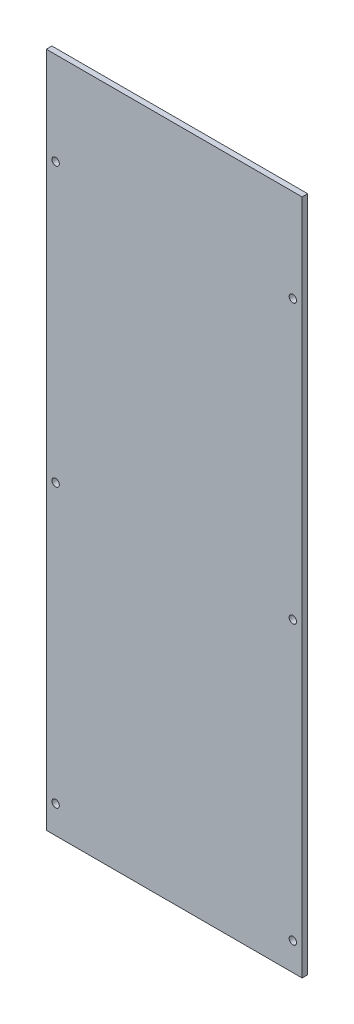
ISO-10303-21;
HEADER;
FILE_DESCRIPTION(('STEP AP214'),'2;1');
FILE_NAME('part.step','',(''),(''),'','','');
FILE_SCHEMA(('AUTOMOTIVE_DESIGN { 1 0 10303 214 1 1 1 1 }'));
ENDSEC;
DATA;
#1=APPLICATION_CONTEXT('core data for automotive mechanical design processes');
#2=APPLICATION_PROTOCOL_DEFINITION('international standard','automotive_design',2000,#1);
#3=PRODUCT_CONTEXT('',#1,'mechanical');
#4=PRODUCT('Part','Part','',(#3));
#5=PRODUCT_RELATED_PRODUCT_CATEGORY('part','',(#4));
#6=PRODUCT_DEFINITION_FORMATION('','',#4);
#7=PRODUCT_DEFINITION_CONTEXT('part definition',#1,'design');
#8=PRODUCT_DEFINITION('design','',#6,#7);
#9=PRODUCT_DEFINITION_SHAPE('','',#8);
#10=(LENGTH_UNIT() NAMED_UNIT(*) SI_UNIT(.MILLI.,.METRE.));
#11=(NAMED_UNIT(*) PLANE_ANGLE_UNIT() SI_UNIT($,.RADIAN.));
#12=(NAMED_UNIT(*) SI_UNIT($,.STERADIAN.) SOLID_ANGLE_UNIT());
#13=UNCERTAINTY_MEASURE_WITH_UNIT(LENGTH_MEASURE(1.E-05),#10,'distance_accuracy_value','');
#14=(GEOMETRIC_REPRESENTATION_CONTEXT(3) GLOBAL_UNCERTAINTY_ASSIGNED_CONTEXT((#13)) GLOBAL_UNIT_ASSIGNED_CONTEXT((#10,
#11,#12)) REPRESENTATION_CONTEXT('',''));
#15=CARTESIAN_POINT('',(0.,0.,0.));
#16=DIRECTION('',(0.,0.,1.));
#17=DIRECTION('',(1.,0.,0.));
#18=AXIS2_PLACEMENT_3D('',#15,#16,#17);
#19=CARTESIAN_POINT('',(0.,0.,3.));
#20=DIRECTION('',(0.,0.,1.));
#21=DIRECTION('',(1.,0.,0.));
#22=AXIS2_PLACEMENT_3D('',#19,#20,#21);
#23=PLANE('',#22);
#24=CARTESIAN_POINT('',(133.,-50.,3.));
#25=DIRECTION('',(0.,0.,1.));
#26=DIRECTION('',(1.,0.,0.));
#27=AXIS2_PLACEMENT_3D('',#24,#25,#26);
#28=CIRCLE('',#27,2.);
#29=CARTESIAN_POINT('',(135.,-50.,3.));
#30=VERTEX_POINT('',#29);
#31=EDGE_CURVE('E132',#30,#30,#28,.T.);
#32=ORIENTED_EDGE('',*,*,#31,.F.);
#33=EDGE_LOOP('',(#32));
#34=FACE_BOUND('',#33,.T.);
#35=CARTESIAN_POINT('',(133.000000000001,-200.,3.));
#36=DIRECTION('',(0.,0.,1.));
#37=DIRECTION('',(1.,0.,0.));
#38=AXIS2_PLACEMENT_3D('',#35,#36,#37);
#39=CIRCLE('',#38,2.);
#40=CARTESIAN_POINT('',(135.000000000001,-200.,3.));
#41=VERTEX_POINT('',#40);
#42=EDGE_CURVE('E120',#41,#41,#39,.T.);
#43=ORIENTED_EDGE('',*,*,#42,.F.);
#44=EDGE_LOOP('',(#43));
#45=FACE_BOUND('',#44,.T.);
#46=CARTESIAN_POINT('',(133.000000000002,-350.,3.));
#47=DIRECTION('',(0.,0.,1.));
#48=DIRECTION('',(1.,0.,0.));
#49=AXIS2_PLACEMENT_3D('',#46,#47,#48);
#50=CIRCLE('',#49,2.);
#51=CARTESIAN_POINT('',(135.000000000002,-350.,3.));
#52=VERTEX_POINT('',#51);
#53=EDGE_CURVE('E99',#52,#52,#50,.T.);
#54=ORIENTED_EDGE('',*,*,#53,.F.);
#55=EDGE_LOOP('',(#54));
#56=FACE_BOUND('',#55,.T.);
#57=DIRECTION('',(0.,-1.,0.));
#58=VECTOR('',#57,1.);
#59=CARTESIAN_POINT('',(0.,0.,3.));
#60=LINE('',#59,#58);
#61=CARTESIAN_POINT('',(0.,0.,3.));
#62=VERTEX_POINT('',#61);
#63=CARTESIAN_POINT('',(0.,-365.000000000006,3.));
#64=VERTEX_POINT('',#63);
#65=EDGE_CURVE('E84',#62,#64,#60,.T.);
#66=ORIENTED_EDGE('',*,*,#65,.T.);
#67=DIRECTION('',(1.,0.,0.));
#68=VECTOR('',#67,1.);
#69=CARTESIAN_POINT('',(0.,-365.000000000006,3.));
#70=LINE('',#69,#68);
#71=CARTESIAN_POINT('',(138.,-365.000000000006,3.));
#72=VERTEX_POINT('',#71);
#73=EDGE_CURVE('E79',#64,#72,#70,.T.);
#74=ORIENTED_EDGE('',*,*,#73,.T.);
#75=DIRECTION('',(0.,1.,0.));
#76=VECTOR('',#75,1.);
#77=CARTESIAN_POINT('',(138.,0.,3.));
#78=LINE('',#77,#76);
#79=CARTESIAN_POINT('',(138.,0.,3.));
#80=VERTEX_POINT('',#79);
#81=EDGE_CURVE('E82',#72,#80,#78,.T.);
#82=ORIENTED_EDGE('',*,*,#81,.T.);
#83=DIRECTION('',(-1.,0.,0.));
#84=VECTOR('',#83,1.);
#85=CARTESIAN_POINT('',(0.,0.,3.));
#86=LINE('',#85,#84);
#87=EDGE_CURVE('E49',#80,#62,#86,.T.);
#88=ORIENTED_EDGE('',*,*,#87,.T.);
#89=EDGE_LOOP('',(#66,#74,#82,#88));
#90=FACE_BOUND('',#89,.T.);
#91=CARTESIAN_POINT('',(5.00000000000211,-350.000000000001,3.));
#92=DIRECTION('',(0.,0.,1.));
#93=DIRECTION('',(1.,0.,0.));
#94=AXIS2_PLACEMENT_3D('',#91,#92,#93);
#95=CIRCLE('',#94,2.);
#96=CARTESIAN_POINT('',(7.00000000000211,-350.000000000001,3.));
#97=VERTEX_POINT('',#96);
#98=EDGE_CURVE('E114',#97,#97,#95,.T.);
#99=ORIENTED_EDGE('',*,*,#98,.F.);
#100=EDGE_LOOP('',(#99));
#101=FACE_BOUND('',#100,.T.);
#102=CARTESIAN_POINT('',(5.00000000000106,-200.000000000001,3.));
#103=DIRECTION('',(0.,0.,1.));
#104=DIRECTION('',(1.,0.,0.));
#105=AXIS2_PLACEMENT_3D('',#102,#103,#104);
#106=CIRCLE('',#105,2.);
#107=CARTESIAN_POINT('',(7.00000000000106,-200.000000000001,3.));
#108=VERTEX_POINT('',#107);
#109=EDGE_CURVE('E126',#108,#108,#106,.T.);
#110=ORIENTED_EDGE('',*,*,#109,.F.);
#111=EDGE_LOOP('',(#110));
#112=FACE_BOUND('',#111,.T.);
#113=CARTESIAN_POINT('',(5.,-50.0000000000009,3.));
#114=DIRECTION('',(0.,0.,1.));
#115=DIRECTION('',(1.,0.,0.));
#116=AXIS2_PLACEMENT_3D('',#113,#114,#115);
#117=CIRCLE('',#116,2.);
#118=CARTESIAN_POINT('',(7.,-50.0000000000009,3.));
#119=VERTEX_POINT('',#118);
#120=EDGE_CURVE('E138',#119,#119,#117,.T.);
#121=ORIENTED_EDGE('',*,*,#120,.F.);
#122=EDGE_LOOP('',(#121));
#123=FACE_BOUND('',#122,.T.);
#124=ADVANCED_FACE('F32',(#34,#45,#56,#90,#101,#112,#123),#23,.T.);
#125=CARTESIAN_POINT('',(0.,0.,0.));
#126=DIRECTION('',(0.,0.,1.));
#127=DIRECTION('',(1.,0.,0.));
#128=AXIS2_PLACEMENT_3D('',#125,#126,#127);
#129=PLANE('',#128);
#130=DIRECTION('',(0.,-1.,0.));
#131=VECTOR('',#130,1.);
#132=CARTESIAN_POINT('',(0.,0.,0.));
#133=LINE('',#132,#131);
#134=CARTESIAN_POINT('',(0.,0.,0.));
#135=VERTEX_POINT('',#134);
#136=CARTESIAN_POINT('',(0.,-365.000000000006,0.));
#137=VERTEX_POINT('',#136);
#138=EDGE_CURVE('E96',#135,#137,#133,.T.);
#139=ORIENTED_EDGE('',*,*,#138,.F.);
#140=DIRECTION('',(-1.,0.,0.));
#141=VECTOR('',#140,1.);
#142=CARTESIAN_POINT('',(0.,0.,0.));
#143=LINE('',#142,#141);
#144=CARTESIAN_POINT('',(138.,0.,0.));
#145=VERTEX_POINT('',#144);
#146=EDGE_CURVE('E72',#145,#135,#143,.T.);
#147=ORIENTED_EDGE('',*,*,#146,.F.);
#148=DIRECTION('',(0.,1.,0.));
#149=VECTOR('',#148,1.);
#150=CARTESIAN_POINT('',(138.,0.,0.));
#151=LINE('',#150,#149);
#152=CARTESIAN_POINT('',(138.,-365.000000000006,0.));
#153=VERTEX_POINT('',#152);
#154=EDGE_CURVE('E66',#153,#145,#151,.T.);
#155=ORIENTED_EDGE('',*,*,#154,.F.);
#156=DIRECTION('',(1.,0.,0.));
#157=VECTOR('',#156,1.);
#158=CARTESIAN_POINT('',(0.,-365.000000000006,0.));
#159=LINE('',#158,#157);
#160=EDGE_CURVE('E88',#137,#153,#159,.T.);
#161=ORIENTED_EDGE('',*,*,#160,.F.);
#162=EDGE_LOOP('',(#139,#147,#155,#161));
#163=FACE_BOUND('',#162,.T.);
#164=CARTESIAN_POINT('',(133.000000000002,-350.,0.));
#165=DIRECTION('',(0.,0.,1.));
#166=DIRECTION('',(1.,0.,0.));
#167=AXIS2_PLACEMENT_3D('',#164,#165,#166);
#168=CIRCLE('',#167,2.);
#169=CARTESIAN_POINT('',(135.000000000002,-350.,0.));
#170=VERTEX_POINT('',#169);
#171=EDGE_CURVE('E111',#170,#170,#168,.T.);
#172=ORIENTED_EDGE('',*,*,#171,.T.);
#173=EDGE_LOOP('',(#172));
#174=FACE_BOUND('',#173,.T.);
#175=CARTESIAN_POINT('',(5.00000000000211,-350.000000000001,0.));
#176=DIRECTION('',(0.,0.,1.));
#177=DIRECTION('',(1.,0.,0.));
#178=AXIS2_PLACEMENT_3D('',#175,#176,#177);
#179=CIRCLE('',#178,2.);
#180=CARTESIAN_POINT('',(7.00000000000211,-350.000000000001,0.));
#181=VERTEX_POINT('',#180);
#182=EDGE_CURVE('E117',#181,#181,#179,.T.);
#183=ORIENTED_EDGE('',*,*,#182,.T.);
#184=EDGE_LOOP('',(#183));
#185=FACE_BOUND('',#184,.T.);
#186=CARTESIAN_POINT('',(133.000000000001,-200.,0.));
#187=DIRECTION('',(0.,0.,1.));
#188=DIRECTION('',(1.,0.,0.));
#189=AXIS2_PLACEMENT_3D('',#186,#187,#188);
#190=CIRCLE('',#189,2.);
#191=CARTESIAN_POINT('',(135.000000000001,-200.,0.));
#192=VERTEX_POINT('',#191);
#193=EDGE_CURVE('E123',#192,#192,#190,.T.);
#194=ORIENTED_EDGE('',*,*,#193,.T.);
#195=EDGE_LOOP('',(#194));
#196=FACE_BOUND('',#195,.T.);
#197=CARTESIAN_POINT('',(5.00000000000106,-200.000000000001,0.));
#198=DIRECTION('',(0.,0.,1.));
#199=DIRECTION('',(1.,0.,0.));
#200=AXIS2_PLACEMENT_3D('',#197,#198,#199);
#201=CIRCLE('',#200,2.);
#202=CARTESIAN_POINT('',(7.00000000000106,-200.000000000001,0.));
#203=VERTEX_POINT('',#202);
#204=EDGE_CURVE('E129',#203,#203,#201,.T.);
#205=ORIENTED_EDGE('',*,*,#204,.T.);
#206=EDGE_LOOP('',(#205));
#207=FACE_BOUND('',#206,.T.);
#208=CARTESIAN_POINT('',(133.,-50.,0.));
#209=DIRECTION('',(0.,0.,1.));
#210=DIRECTION('',(1.,0.,0.));
#211=AXIS2_PLACEMENT_3D('',#208,#209,#210);
#212=CIRCLE('',#211,2.);
#213=CARTESIAN_POINT('',(135.,-50.,0.));
#214=VERTEX_POINT('',#213);
#215=EDGE_CURVE('E135',#214,#214,#212,.T.);
#216=ORIENTED_EDGE('',*,*,#215,.T.);
#217=EDGE_LOOP('',(#216));
#218=FACE_BOUND('',#217,.T.);
#219=CARTESIAN_POINT('',(5.,-50.0000000000009,0.));
#220=DIRECTION('',(0.,0.,1.));
#221=DIRECTION('',(1.,0.,0.));
#222=AXIS2_PLACEMENT_3D('',#219,#220,#221);
#223=CIRCLE('',#222,2.);
#224=CARTESIAN_POINT('',(7.,-50.0000000000009,0.));
#225=VERTEX_POINT('',#224);
#226=EDGE_CURVE('E141',#225,#225,#223,.T.);
#227=ORIENTED_EDGE('',*,*,#226,.T.);
#228=EDGE_LOOP('',(#227));
#229=FACE_BOUND('',#228,.T.);
#230=ADVANCED_FACE('F107',(#163,#174,#185,#196,#207,#218,#229),#129,.F.);
#231=CARTESIAN_POINT('',(0.,0.,3.));
#232=DIRECTION('',(1.,0.,0.));
#233=DIRECTION('',(0.,0.,-1.));
#234=AXIS2_PLACEMENT_3D('',#231,#232,#233);
#235=PLANE('',#234);
#236=ORIENTED_EDGE('',*,*,#138,.T.);
#237=DIRECTION('',(0.,0.,-1.));
#238=VECTOR('',#237,1.);
#239=CARTESIAN_POINT('',(0.,-365.000000000006,3.));
#240=LINE('',#239,#238);
#241=EDGE_CURVE('E11',#64,#137,#240,.T.);
#242=ORIENTED_EDGE('',*,*,#241,.F.);
#243=ORIENTED_EDGE('',*,*,#65,.F.);
#244=DIRECTION('',(0.,0.,-1.));
#245=VECTOR('',#244,1.);
#246=CARTESIAN_POINT('',(0.,0.,3.));
#247=LINE('',#246,#245);
#248=EDGE_CURVE('E92',#62,#135,#247,.T.);
#249=ORIENTED_EDGE('',*,*,#248,.T.);
#250=EDGE_LOOP('',(#236,#242,#243,#249));
#251=FACE_BOUND('',#250,.T.);
#252=ADVANCED_FACE('F34',(#251),#235,.F.);
#253=CARTESIAN_POINT('',(0.,-365.000000000006,3.));
#254=DIRECTION('',(0.,1.,0.));
#255=DIRECTION('',(0.,0.,1.));
#256=AXIS2_PLACEMENT_3D('',#253,#254,#255);
#257=PLANE('',#256);
#258=ORIENTED_EDGE('',*,*,#160,.T.);
#259=DIRECTION('',(0.,0.,-1.));
#260=VECTOR('',#259,1.);
#261=CARTESIAN_POINT('',(138.,-365.000000000006,3.));
#262=LINE('',#261,#260);
#263=EDGE_CURVE('E41',#72,#153,#262,.T.);
#264=ORIENTED_EDGE('',*,*,#263,.F.);
#265=ORIENTED_EDGE('',*,*,#73,.F.);
#266=ORIENTED_EDGE('',*,*,#241,.T.);
#267=EDGE_LOOP('',(#258,#264,#265,#266));
#268=FACE_BOUND('',#267,.T.);
#269=ADVANCED_FACE('F87',(#268),#257,.F.);
#270=CARTESIAN_POINT('',(138.,0.,3.));
#271=DIRECTION('',(-1.,0.,0.));
#272=DIRECTION('',(0.,0.,1.));
#273=AXIS2_PLACEMENT_3D('',#270,#271,#272);
#274=PLANE('',#273);
#275=ORIENTED_EDGE('',*,*,#154,.T.);
#276=DIRECTION('',(0.,0.,-1.));
#277=VECTOR('',#276,1.);
#278=CARTESIAN_POINT('',(138.,0.,3.));
#279=LINE('',#278,#277);
#280=EDGE_CURVE('E89',#80,#145,#279,.T.);
#281=ORIENTED_EDGE('',*,*,#280,.F.);
#282=ORIENTED_EDGE('',*,*,#81,.F.);
#283=ORIENTED_EDGE('',*,*,#263,.T.);
#284=EDGE_LOOP('',(#275,#281,#282,#283));
#285=FACE_BOUND('',#284,.T.);
#286=ADVANCED_FACE('F90',(#285),#274,.F.);
#287=CARTESIAN_POINT('',(0.,0.,3.));
#288=DIRECTION('',(0.,-1.,0.));
#289=DIRECTION('',(0.,0.,-1.));
#290=AXIS2_PLACEMENT_3D('',#287,#288,#289);
#291=PLANE('',#290);
#292=ORIENTED_EDGE('',*,*,#146,.T.);
#293=ORIENTED_EDGE('',*,*,#248,.F.);
#294=ORIENTED_EDGE('',*,*,#87,.F.);
#295=ORIENTED_EDGE('',*,*,#280,.T.);
#296=EDGE_LOOP('',(#292,#293,#294,#295));
#297=FACE_BOUND('',#296,.T.);
#298=ADVANCED_FACE('F104',(#297),#291,.F.);
#299=CARTESIAN_POINT('',(133.000000000002,-350.,3.));
#300=DIRECTION('',(0.,0.,-1.));
#301=DIRECTION('',(-1.,0.,0.));
#302=AXIS2_PLACEMENT_3D('',#299,#300,#301);
#303=CYLINDRICAL_SURFACE('',#302,2.);
#304=ORIENTED_EDGE('',*,*,#53,.T.);
#305=EDGE_LOOP('',(#304));
#306=FACE_BOUND('',#305,.T.);
#307=ORIENTED_EDGE('',*,*,#171,.F.);
#308=EDGE_LOOP('',(#307));
#309=FACE_BOUND('',#308,.T.);
#310=ADVANCED_FACE('F160',(#306,#309),#303,.F.);
#311=CARTESIAN_POINT('',(5.00000000000211,-350.000000000001,3.));
#312=DIRECTION('',(0.,0.,-1.));
#313=DIRECTION('',(-1.,0.,0.));
#314=AXIS2_PLACEMENT_3D('',#311,#312,#313);
#315=CYLINDRICAL_SURFACE('',#314,2.);
#316=ORIENTED_EDGE('',*,*,#98,.T.);
#317=EDGE_LOOP('',(#316));
#318=FACE_BOUND('',#317,.T.);
#319=ORIENTED_EDGE('',*,*,#182,.F.);
#320=EDGE_LOOP('',(#319));
#321=FACE_BOUND('',#320,.T.);
#322=ADVANCED_FACE('F206',(#318,#321),#315,.F.);
#323=CARTESIAN_POINT('',(133.000000000001,-200.,3.));
#324=DIRECTION('',(0.,0.,-1.));
#325=DIRECTION('',(-1.,0.,0.));
#326=AXIS2_PLACEMENT_3D('',#323,#324,#325);
#327=CYLINDRICAL_SURFACE('',#326,2.);
#328=ORIENTED_EDGE('',*,*,#42,.T.);
#329=EDGE_LOOP('',(#328));
#330=FACE_BOUND('',#329,.T.);
#331=ORIENTED_EDGE('',*,*,#193,.F.);
#332=EDGE_LOOP('',(#331));
#333=FACE_BOUND('',#332,.T.);
#334=ADVANCED_FACE('F214',(#330,#333),#327,.F.);
#335=CARTESIAN_POINT('',(5.00000000000106,-200.000000000001,3.));
#336=DIRECTION('',(0.,0.,-1.));
#337=DIRECTION('',(-1.,0.,0.));
#338=AXIS2_PLACEMENT_3D('',#335,#336,#337);
#339=CYLINDRICAL_SURFACE('',#338,2.);
#340=ORIENTED_EDGE('',*,*,#109,.T.);
#341=EDGE_LOOP('',(#340));
#342=FACE_BOUND('',#341,.T.);
#343=ORIENTED_EDGE('',*,*,#204,.F.);
#344=EDGE_LOOP('',(#343));
#345=FACE_BOUND('',#344,.T.);
#346=ADVANCED_FACE('F222',(#342,#345),#339,.F.);
#347=CARTESIAN_POINT('',(133.,-50.,3.));
#348=DIRECTION('',(0.,0.,-1.));
#349=DIRECTION('',(-1.,0.,0.));
#350=AXIS2_PLACEMENT_3D('',#347,#348,#349);
#351=CYLINDRICAL_SURFACE('',#350,2.);
#352=ORIENTED_EDGE('',*,*,#31,.T.);
#353=EDGE_LOOP('',(#352));
#354=FACE_BOUND('',#353,.T.);
#355=ORIENTED_EDGE('',*,*,#215,.F.);
#356=EDGE_LOOP('',(#355));
#357=FACE_BOUND('',#356,.T.);
#358=ADVANCED_FACE('F231',(#354,#357),#351,.F.);
#359=CARTESIAN_POINT('',(5.,-50.0000000000009,3.));
#360=DIRECTION('',(0.,0.,-1.));
#361=DIRECTION('',(-1.,0.,0.));
#362=AXIS2_PLACEMENT_3D('',#359,#360,#361);
#363=CYLINDRICAL_SURFACE('',#362,2.);
#364=ORIENTED_EDGE('',*,*,#120,.T.);
#365=EDGE_LOOP('',(#364));
#366=FACE_BOUND('',#365,.T.);
#367=ORIENTED_EDGE('',*,*,#226,.F.);
#368=EDGE_LOOP('',(#367));
#369=FACE_BOUND('',#368,.T.);
#370=ADVANCED_FACE('F147',(#366,#369),#363,.F.);
#371=CLOSED_SHELL('',(#124,#230,#252,#269,#286,#298,#310,#322,#334,#346,#358,#370));
#372=MANIFOLD_SOLID_BREP('B2',#371);
#373=ADVANCED_BREP_SHAPE_REPRESENTATION('',(#18,#372),#14);
#374=SHAPE_DEFINITION_REPRESENTATION(#9,#373);
ENDSEC;
END-ISO-10303-21;
